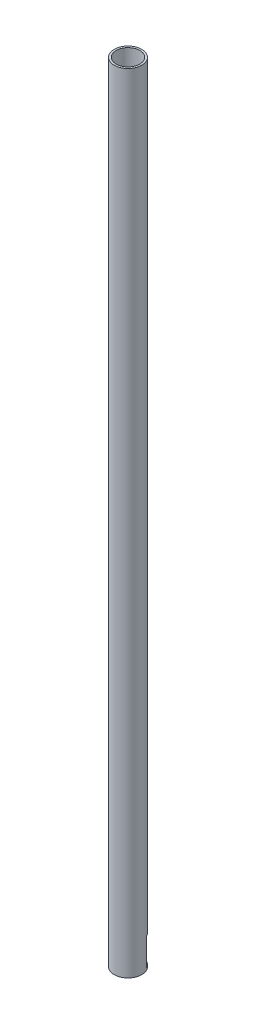
ISO-10303-21;
HEADER;
FILE_DESCRIPTION(('STEP AP214'),'2;1');
FILE_NAME('part.step','',(''),(''),'','','');
FILE_SCHEMA(('AUTOMOTIVE_DESIGN { 1 0 10303 214 1 1 1 1 }'));
ENDSEC;
DATA;
#1=APPLICATION_CONTEXT('core data for automotive mechanical design processes');
#2=APPLICATION_PROTOCOL_DEFINITION('international standard','automotive_design',2000,#1);
#3=PRODUCT_CONTEXT('',#1,'mechanical');
#4=PRODUCT('Part','Part','',(#3));
#5=PRODUCT_RELATED_PRODUCT_CATEGORY('part','',(#4));
#6=PRODUCT_DEFINITION_FORMATION('','',#4);
#7=PRODUCT_DEFINITION_CONTEXT('part definition',#1,'design');
#8=PRODUCT_DEFINITION('design','',#6,#7);
#9=PRODUCT_DEFINITION_SHAPE('','',#8);
#10=(LENGTH_UNIT() NAMED_UNIT(*) SI_UNIT(.MILLI.,.METRE.));
#11=(NAMED_UNIT(*) PLANE_ANGLE_UNIT() SI_UNIT($,.RADIAN.));
#12=(NAMED_UNIT(*) SI_UNIT($,.STERADIAN.) SOLID_ANGLE_UNIT());
#13=UNCERTAINTY_MEASURE_WITH_UNIT(LENGTH_MEASURE(1.E-05),#10,'distance_accuracy_value','');
#14=(GEOMETRIC_REPRESENTATION_CONTEXT(3) GLOBAL_UNCERTAINTY_ASSIGNED_CONTEXT((#13)) GLOBAL_UNIT_ASSIGNED_CONTEXT((#10,
#11,#12)) REPRESENTATION_CONTEXT('',''));
#15=CARTESIAN_POINT('',(0.,0.,0.));
#16=DIRECTION('',(0.,0.,1.));
#17=DIRECTION('',(1.,0.,0.));
#18=AXIS2_PLACEMENT_3D('',#15,#16,#17);
#19=CARTESIAN_POINT('',(0.,400.,-1.04083408558608E-13));
#20=DIRECTION('',(0.,-1.,0.));
#21=DIRECTION('',(0.,0.,-0.999999999999999));
#22=AXIS2_PLACEMENT_3D('',#19,#20,#21);
#23=CYLINDRICAL_SURFACE('',#22,7.);
#24=CARTESIAN_POINT('',(0.,0.,0.));
#25=DIRECTION('',(0.,1.,0.));
#26=DIRECTION('',(0.,0.,0.999999999999999));
#27=AXIS2_PLACEMENT_3D('',#24,#25,#26);
#28=CIRCLE('',#27,7.);
#29=CARTESIAN_POINT('',(0.,0.,6.99999999999999));
#30=VERTEX_POINT('',#29);
#31=EDGE_CURVE('E131',#30,#30,#28,.T.);
#32=ORIENTED_EDGE('',*,*,#31,.T.);
#33=EDGE_LOOP('',(#32));
#34=FACE_BOUND('',#33,.T.);
#35=CARTESIAN_POINT('',(0.,400.,-1.04083408558608E-13));
#36=DIRECTION('',(0.,1.,0.));
#37=DIRECTION('',(0.,0.,0.999999999999999));
#38=AXIS2_PLACEMENT_3D('',#35,#36,#37);
#39=CIRCLE('',#38,7.);
#40=CARTESIAN_POINT('',(0.,400.,6.99999999999989));
#41=VERTEX_POINT('',#40);
#42=EDGE_CURVE('E134',#41,#41,#39,.T.);
#43=ORIENTED_EDGE('',*,*,#42,.F.);
#44=EDGE_LOOP('',(#43));
#45=FACE_BOUND('',#44,.T.);
#46=DIRECTION('',(0.,-1.,0.));
#47=VECTOR('',#46,1.);
#48=CARTESIAN_POINT('',(-5.99999999999992,400.000000000001,-3.60555127546412));
#49=LINE('',#48,#47);
#50=CARTESIAN_POINT('',(-5.99999999999998,1.,-3.60555127546398));
#51=VERTEX_POINT('',#50);
#52=CARTESIAN_POINT('',(-6.,15.,-3.60555127546396));
#53=VERTEX_POINT('',#52);
#54=EDGE_CURVE('E13',#51,#53,#49,.F.);
#55=ORIENTED_EDGE('',*,*,#54,.F.);
#56=CARTESIAN_POINT('',(0.,0.999999999999945,0.));
#57=DIRECTION('',(0.,1.,0.));
#58=DIRECTION('',(0.,0.,0.999999999999999));
#59=AXIS2_PLACEMENT_3D('',#56,#57,#58);
#60=CIRCLE('',#59,7.);
#61=CARTESIAN_POINT('',(6.32455532033679,1.,-3.00000000000001));
#62=VERTEX_POINT('',#61);
#63=EDGE_CURVE('E116',#62,#51,#60,.T.);
#64=ORIENTED_EDGE('',*,*,#63,.F.);
#65=DIRECTION('',(0.,-1.,0.));
#66=VECTOR('',#65,1.);
#67=CARTESIAN_POINT('',(6.32455532033684,400.000000000001,-3.00000000000016));
#68=LINE('',#67,#66);
#69=CARTESIAN_POINT('',(6.32455532033676,15.,-3.00000000000001));
#70=VERTEX_POINT('',#69);
#71=EDGE_CURVE('E117',#62,#70,#68,.F.);
#72=ORIENTED_EDGE('',*,*,#71,.T.);
#73=CARTESIAN_POINT('',(0.,15.,0.));
#74=DIRECTION('',(0.,-1.,0.));
#75=DIRECTION('',(0.,0.,-0.999999999999999));
#76=AXIS2_PLACEMENT_3D('',#73,#74,#75);
#77=CIRCLE('',#76,7.);
#78=EDGE_CURVE('E120',#53,#70,#77,.T.);
#79=ORIENTED_EDGE('',*,*,#78,.F.);
#80=EDGE_LOOP('',(#55,#64,#72,#79));
#81=FACE_BOUND('',#80,.T.);
#82=ADVANCED_FACE('F50',(#34,#45,#81),#23,.T.);
#83=CARTESIAN_POINT('',(0.,400.,-1.04083408558608E-13));
#84=DIRECTION('',(0.,1.,0.));
#85=DIRECTION('',(0.,0.,0.999999999999999));
#86=AXIS2_PLACEMENT_3D('',#83,#84,#85);
#87=PLANE('',#86);
#88=ORIENTED_EDGE('',*,*,#42,.T.);
#89=EDGE_LOOP('',(#88));
#90=FACE_BOUND('',#89,.T.);
#91=CARTESIAN_POINT('',(0.,400.,-1.04083408558608E-13));
#92=DIRECTION('',(0.,1.,0.));
#93=DIRECTION('',(0.,0.,0.999999999999999));
#94=AXIS2_PLACEMENT_3D('',#91,#92,#93);
#95=CIRCLE('',#94,6.);
#96=CARTESIAN_POINT('',(0.,400.,5.99999999999989));
#97=VERTEX_POINT('',#96);
#98=EDGE_CURVE('E128',#97,#97,#95,.T.);
#99=ORIENTED_EDGE('',*,*,#98,.F.);
#100=EDGE_LOOP('',(#99));
#101=FACE_BOUND('',#100,.T.);
#102=ADVANCED_FACE('F163',(#90,#101),#87,.T.);
#103=CARTESIAN_POINT('',(0.,0.,0.));
#104=DIRECTION('',(0.,1.,0.));
#105=DIRECTION('',(0.,0.,0.999999999999999));
#106=AXIS2_PLACEMENT_3D('',#103,#104,#105);
#107=PLANE('',#106);
#108=ORIENTED_EDGE('',*,*,#31,.F.);
#109=EDGE_LOOP('',(#108));
#110=FACE_BOUND('',#109,.T.);
#111=CARTESIAN_POINT('',(0.,0.,0.));
#112=DIRECTION('',(0.,1.,0.));
#113=DIRECTION('',(0.,0.,0.999999999999999));
#114=AXIS2_PLACEMENT_3D('',#111,#112,#113);
#115=CIRCLE('',#114,6.);
#116=CARTESIAN_POINT('',(0.,0.,5.99999999999999));
#117=VERTEX_POINT('',#116);
#118=EDGE_CURVE('E127',#117,#117,#115,.T.);
#119=ORIENTED_EDGE('',*,*,#118,.T.);
#120=EDGE_LOOP('',(#119));
#121=FACE_BOUND('',#120,.T.);
#122=ADVANCED_FACE('F168',(#110,#121),#107,.F.);
#123=CARTESIAN_POINT('',(0.,400.,-1.04083408558608E-13));
#124=DIRECTION('',(0.,-1.,0.));
#125=DIRECTION('',(0.,0.,-0.999999999999999));
#126=AXIS2_PLACEMENT_3D('',#123,#124,#125);
#127=CYLINDRICAL_SURFACE('',#126,6.);
#128=DIRECTION('',(0.,-1.,0.));
#129=VECTOR('',#128,1.);
#130=CARTESIAN_POINT('',(-5.19615242270657,400.,-3.00000000000007));
#131=LINE('',#130,#129);
#132=CARTESIAN_POINT('',(-5.19615242270663,14.9999999999999,-2.99999999999995));
#133=VERTEX_POINT('',#132);
#134=CARTESIAN_POINT('',(-5.19615242270661,0.999999999999973,-2.99999999999998));
#135=VERTEX_POINT('',#134);
#136=EDGE_CURVE('E57',#133,#135,#131,.T.);
#137=ORIENTED_EDGE('',*,*,#136,.F.);
#138=CARTESIAN_POINT('',(0.,15.,0.));
#139=DIRECTION('',(0.,-1.,0.));
#140=DIRECTION('',(0.,0.,-0.999999999999999));
#141=AXIS2_PLACEMENT_3D('',#138,#139,#140);
#142=CIRCLE('',#141,6.);
#143=CARTESIAN_POINT('',(5.19615242270663,15.,-3.));
#144=VERTEX_POINT('',#143);
#145=EDGE_CURVE('E141',#133,#144,#142,.T.);
#146=ORIENTED_EDGE('',*,*,#145,.T.);
#147=DIRECTION('',(0.,-1.,0.));
#148=VECTOR('',#147,1.);
#149=CARTESIAN_POINT('',(5.1961524227067,400.,-3.00000000000008));
#150=LINE('',#149,#148);
#151=CARTESIAN_POINT('',(5.19615242270659,0.999999999999945,-3.00000000000001));
#152=VERTEX_POINT('',#151);
#153=EDGE_CURVE('E137',#152,#144,#150,.F.);
#154=ORIENTED_EDGE('',*,*,#153,.F.);
#155=CARTESIAN_POINT('',(0.,0.999999999999945,0.));
#156=DIRECTION('',(0.,1.,0.));
#157=DIRECTION('',(0.,0.,0.999999999999999));
#158=AXIS2_PLACEMENT_3D('',#155,#156,#157);
#159=CIRCLE('',#158,6.);
#160=EDGE_CURVE('E144',#152,#135,#159,.T.);
#161=ORIENTED_EDGE('',*,*,#160,.T.);
#162=EDGE_LOOP('',(#137,#146,#154,#161));
#163=FACE_BOUND('',#162,.T.);
#164=ORIENTED_EDGE('',*,*,#98,.T.);
#165=EDGE_LOOP('',(#164));
#166=FACE_BOUND('',#165,.T.);
#167=ORIENTED_EDGE('',*,*,#118,.F.);
#168=EDGE_LOOP('',(#167));
#169=FACE_BOUND('',#168,.T.);
#170=ADVANCED_FACE('F147',(#163,#166,#169),#127,.F.);
#171=CARTESIAN_POINT('',(-5.99999999999996,0.,-2.99999999999998));
#172=DIRECTION('',(1.,0.,0.));
#173=DIRECTION('',(0.,0.,-0.999999999999999));
#174=AXIS2_PLACEMENT_3D('',#171,#172,#173);
#175=PLANE('',#174);
#176=ORIENTED_EDGE('',*,*,#54,.T.);
#177=DIRECTION('',(0.,0.,-0.999999999999999));
#178=VECTOR('',#177,1.);
#179=CARTESIAN_POINT('',(-5.99999999999998,15.,-2.99999999999995));
#180=LINE('',#179,#178);
#181=CARTESIAN_POINT('',(-5.99999999999998,15.,-2.99999999999995));
#182=VERTEX_POINT('',#181);
#183=EDGE_CURVE('E112',#182,#53,#180,.T.);
#184=ORIENTED_EDGE('',*,*,#183,.F.);
#185=DIRECTION('',(0.,-1.,0.));
#186=VECTOR('',#185,1.);
#187=CARTESIAN_POINT('',(-5.99999999999996,0.,-2.99999999999998));
#188=LINE('',#187,#186);
#189=CARTESIAN_POINT('',(-5.99999999999999,0.999999999999945,-2.99999999999994));
#190=VERTEX_POINT('',#189);
#191=EDGE_CURVE('E98',#182,#190,#188,.T.);
#192=ORIENTED_EDGE('',*,*,#191,.T.);
#193=DIRECTION('',(0.,0.,-0.999999999999999));
#194=VECTOR('',#193,1.);
#195=CARTESIAN_POINT('',(-5.99999999999999,0.999999999999945,-2.99999999999994));
#196=LINE('',#195,#194);
#197=EDGE_CURVE('E109',#190,#51,#196,.T.);
#198=ORIENTED_EDGE('',*,*,#197,.T.);
#199=EDGE_LOOP('',(#176,#184,#192,#198));
#200=FACE_BOUND('',#199,.T.);
#201=ADVANCED_FACE('F108',(#200),#175,.T.);
#202=CARTESIAN_POINT('',(0.,1.00000000000003,-2.99999999999998));
#203=DIRECTION('',(0.,1.,0.));
#204=DIRECTION('',(0.,0.,0.999999999999999));
#205=AXIS2_PLACEMENT_3D('',#202,#203,#204);
#206=PLANE('',#205);
#207=ORIENTED_EDGE('',*,*,#63,.T.);
#208=ORIENTED_EDGE('',*,*,#197,.F.);
#209=DIRECTION('',(1.,0.,0.));
#210=VECTOR('',#209,1.);
#211=CARTESIAN_POINT('',(0.,1.00000000000003,-2.99999999999998));
#212=LINE('',#211,#210);
#213=EDGE_CURVE('E94',#190,#135,#212,.T.);
#214=ORIENTED_EDGE('',*,*,#213,.T.);
#215=ORIENTED_EDGE('',*,*,#160,.F.);
#216=EDGE_CURVE('E69',#152,#62,#212,.T.);
#217=ORIENTED_EDGE('',*,*,#216,.T.);
#218=EDGE_LOOP('',(#207,#208,#214,#215,#217));
#219=FACE_BOUND('',#218,.T.);
#220=ADVANCED_FACE('F114',(#219),#206,.T.);
#221=CARTESIAN_POINT('',(0.,15.,-3.00000000000001));
#222=DIRECTION('',(0.,-1.,0.));
#223=DIRECTION('',(0.,0.,-0.999999999999999));
#224=AXIS2_PLACEMENT_3D('',#221,#222,#223);
#225=PLANE('',#224);
#226=ORIENTED_EDGE('',*,*,#78,.T.);
#227=DIRECTION('',(-1.,0.,0.));
#228=VECTOR('',#227,1.);
#229=CARTESIAN_POINT('',(0.,15.,-3.00000000000001));
#230=LINE('',#229,#228);
#231=EDGE_CURVE('E64',#70,#144,#230,.T.);
#232=ORIENTED_EDGE('',*,*,#231,.T.);
#233=ORIENTED_EDGE('',*,*,#145,.F.);
#234=EDGE_CURVE('E103',#133,#182,#230,.T.);
#235=ORIENTED_EDGE('',*,*,#234,.T.);
#236=ORIENTED_EDGE('',*,*,#183,.T.);
#237=EDGE_LOOP('',(#226,#232,#233,#235,#236));
#238=FACE_BOUND('',#237,.T.);
#239=ADVANCED_FACE('F152',(#238),#225,.T.);
#240=CARTESIAN_POINT('',(0.,0.,-3.00000000000001));
#241=DIRECTION('',(0.,0.,0.999999999999999));
#242=DIRECTION('',(1.,0.,0.));
#243=AXIS2_PLACEMENT_3D('',#240,#241,#242);
#244=PLANE('',#243);
#245=ORIENTED_EDGE('',*,*,#216,.F.);
#246=ORIENTED_EDGE('',*,*,#153,.T.);
#247=ORIENTED_EDGE('',*,*,#231,.F.);
#248=ORIENTED_EDGE('',*,*,#71,.F.);
#249=EDGE_LOOP('',(#245,#246,#247,#248));
#250=FACE_BOUND('',#249,.T.);
#251=ADVANCED_FACE('F154',(#250),#244,.F.);
#252=ORIENTED_EDGE('',*,*,#136,.T.);
#253=ORIENTED_EDGE('',*,*,#213,.F.);
#254=ORIENTED_EDGE('',*,*,#191,.F.);
#255=ORIENTED_EDGE('',*,*,#234,.F.);
#256=EDGE_LOOP('',(#252,#253,#254,#255));
#257=FACE_BOUND('',#256,.T.);
#258=ADVANCED_FACE('F96',(#257),#244,.F.);
#259=CLOSED_SHELL('',(#82,#102,#122,#170,#201,#220,#239,#251,#258));
#260=MANIFOLD_SOLID_BREP('B2',#259);
#261=ADVANCED_BREP_SHAPE_REPRESENTATION('',(#18,#260),#14);
#262=SHAPE_DEFINITION_REPRESENTATION(#9,#261);
ENDSEC;
END-ISO-10303-21;
